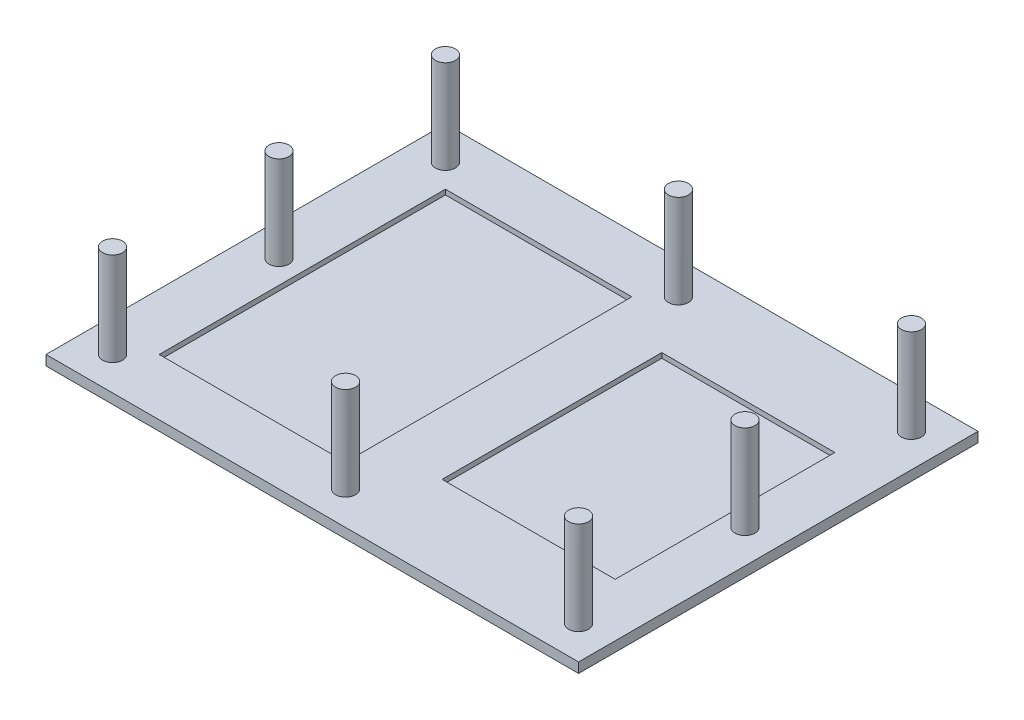
ISO-10303-21;
HEADER;
FILE_DESCRIPTION(('STEP AP214'),'2;1');
FILE_NAME('part.step','',(''),(''),'','','');
FILE_SCHEMA(('AUTOMOTIVE_DESIGN { 1 0 10303 214 1 1 1 1 }'));
ENDSEC;
DATA;
#1=APPLICATION_CONTEXT('core data for automotive mechanical design processes');
#2=APPLICATION_PROTOCOL_DEFINITION('international standard','automotive_design',2000,#1);
#3=PRODUCT_CONTEXT('',#1,'mechanical');
#4=PRODUCT('Part','Part','',(#3));
#5=PRODUCT_RELATED_PRODUCT_CATEGORY('part','',(#4));
#6=PRODUCT_DEFINITION_FORMATION('','',#4);
#7=PRODUCT_DEFINITION_CONTEXT('part definition',#1,'design');
#8=PRODUCT_DEFINITION('design','',#6,#7);
#9=PRODUCT_DEFINITION_SHAPE('','',#8);
#10=(LENGTH_UNIT() NAMED_UNIT(*) SI_UNIT(.MILLI.,.METRE.));
#11=(NAMED_UNIT(*) PLANE_ANGLE_UNIT() SI_UNIT($,.RADIAN.));
#12=(NAMED_UNIT(*) SI_UNIT($,.STERADIAN.) SOLID_ANGLE_UNIT());
#13=UNCERTAINTY_MEASURE_WITH_UNIT(LENGTH_MEASURE(1.E-05),#10,'distance_accuracy_value','');
#14=(GEOMETRIC_REPRESENTATION_CONTEXT(3) GLOBAL_UNCERTAINTY_ASSIGNED_CONTEXT((#13)) GLOBAL_UNIT_ASSIGNED_CONTEXT((#10,
#11,#12)) REPRESENTATION_CONTEXT('',''));
#15=CARTESIAN_POINT('',(0.,0.,0.));
#16=DIRECTION('',(0.,0.,1.));
#17=DIRECTION('',(1.,0.,0.));
#18=AXIS2_PLACEMENT_3D('',#15,#16,#17);
#19=CARTESIAN_POINT('',(80.,3.,60.));
#20=DIRECTION('',(-1.,0.,0.));
#21=DIRECTION('',(0.,0.,1.));
#22=AXIS2_PLACEMENT_3D('',#19,#20,#21);
#23=PLANE('',#22);
#24=DIRECTION('',(0.,0.,-1.));
#25=VECTOR('',#24,1.);
#26=CARTESIAN_POINT('',(80.,0.,60.));
#27=LINE('',#26,#25);
#28=CARTESIAN_POINT('',(80.,0.,60.));
#29=VERTEX_POINT('',#28);
#30=CARTESIAN_POINT('',(80.,0.,-60.));
#31=VERTEX_POINT('',#30);
#32=EDGE_CURVE('E250',#29,#31,#27,.T.);
#33=ORIENTED_EDGE('',*,*,#32,.T.);
#34=DIRECTION('',(0.,-1.,0.));
#35=VECTOR('',#34,1.);
#36=CARTESIAN_POINT('',(80.,3.,-60.));
#37=LINE('',#36,#35);
#38=CARTESIAN_POINT('',(80.,3.,-60.));
#39=VERTEX_POINT('',#38);
#40=EDGE_CURVE('E288',#39,#31,#37,.T.);
#41=ORIENTED_EDGE('',*,*,#40,.F.);
#42=DIRECTION('',(0.,0.,-1.));
#43=VECTOR('',#42,1.);
#44=CARTESIAN_POINT('',(80.,3.,60.));
#45=LINE('',#44,#43);
#46=CARTESIAN_POINT('',(80.,3.,60.));
#47=VERTEX_POINT('',#46);
#48=EDGE_CURVE('E251',#47,#39,#45,.T.);
#49=ORIENTED_EDGE('',*,*,#48,.F.);
#50=DIRECTION('',(0.,-1.,0.));
#51=VECTOR('',#50,1.);
#52=CARTESIAN_POINT('',(80.,3.,60.));
#53=LINE('',#52,#51);
#54=EDGE_CURVE('E265',#47,#29,#53,.T.);
#55=ORIENTED_EDGE('',*,*,#54,.T.);
#56=EDGE_LOOP('',(#33,#41,#49,#55));
#57=FACE_BOUND('',#56,.T.);
#58=ADVANCED_FACE('F39',(#57),#23,.F.);
#59=CARTESIAN_POINT('',(-80.,3.,-60.));
#60=DIRECTION('',(0.,0.,1.));
#61=DIRECTION('',(1.,0.,0.));
#62=AXIS2_PLACEMENT_3D('',#59,#60,#61);
#63=PLANE('',#62);
#64=DIRECTION('',(-1.,0.,0.));
#65=VECTOR('',#64,1.);
#66=CARTESIAN_POINT('',(-80.,0.,-60.));
#67=LINE('',#66,#65);
#68=CARTESIAN_POINT('',(-80.,0.,-60.));
#69=VERTEX_POINT('',#68);
#70=EDGE_CURVE('E269',#31,#69,#67,.T.);
#71=ORIENTED_EDGE('',*,*,#70,.T.);
#72=DIRECTION('',(0.,-1.,0.));
#73=VECTOR('',#72,1.);
#74=CARTESIAN_POINT('',(-80.,3.,-60.));
#75=LINE('',#74,#73);
#76=CARTESIAN_POINT('',(-80.,3.,-60.));
#77=VERTEX_POINT('',#76);
#78=EDGE_CURVE('E284',#77,#69,#75,.T.);
#79=ORIENTED_EDGE('',*,*,#78,.F.);
#80=DIRECTION('',(-1.,0.,0.));
#81=VECTOR('',#80,1.);
#82=CARTESIAN_POINT('',(-80.,3.,-60.));
#83=LINE('',#82,#81);
#84=EDGE_CURVE('E255',#39,#77,#83,.T.);
#85=ORIENTED_EDGE('',*,*,#84,.F.);
#86=ORIENTED_EDGE('',*,*,#40,.T.);
#87=EDGE_LOOP('',(#71,#79,#85,#86));
#88=FACE_BOUND('',#87,.T.);
#89=ADVANCED_FACE('F348',(#88),#63,.F.);
#90=CARTESIAN_POINT('',(-80.,3.,60.));
#91=DIRECTION('',(1.,0.,0.));
#92=DIRECTION('',(0.,0.,-1.));
#93=AXIS2_PLACEMENT_3D('',#90,#91,#92);
#94=PLANE('',#93);
#95=DIRECTION('',(0.,0.,1.));
#96=VECTOR('',#95,1.);
#97=CARTESIAN_POINT('',(-80.,0.,60.));
#98=LINE('',#97,#96);
#99=CARTESIAN_POINT('',(-80.,0.,60.));
#100=VERTEX_POINT('',#99);
#101=EDGE_CURVE('E272',#69,#100,#98,.T.);
#102=ORIENTED_EDGE('',*,*,#101,.T.);
#103=DIRECTION('',(0.,-1.,0.));
#104=VECTOR('',#103,1.);
#105=CARTESIAN_POINT('',(-80.,3.,60.));
#106=LINE('',#105,#104);
#107=CARTESIAN_POINT('',(-80.,3.,60.));
#108=VERTEX_POINT('',#107);
#109=EDGE_CURVE('E280',#108,#100,#106,.T.);
#110=ORIENTED_EDGE('',*,*,#109,.F.);
#111=DIRECTION('',(0.,0.,1.));
#112=VECTOR('',#111,1.);
#113=CARTESIAN_POINT('',(-80.,3.,60.));
#114=LINE('',#113,#112);
#115=EDGE_CURVE('E259',#77,#108,#114,.T.);
#116=ORIENTED_EDGE('',*,*,#115,.F.);
#117=ORIENTED_EDGE('',*,*,#78,.T.);
#118=EDGE_LOOP('',(#102,#110,#116,#117));
#119=FACE_BOUND('',#118,.T.);
#120=ADVANCED_FACE('F353',(#119),#94,.F.);
#121=CARTESIAN_POINT('',(-80.,3.,60.));
#122=DIRECTION('',(0.,0.,-1.));
#123=DIRECTION('',(-1.,0.,0.));
#124=AXIS2_PLACEMENT_3D('',#121,#122,#123);
#125=PLANE('',#124);
#126=DIRECTION('',(1.,0.,0.));
#127=VECTOR('',#126,1.);
#128=CARTESIAN_POINT('',(-80.,0.,60.));
#129=LINE('',#128,#127);
#130=EDGE_CURVE('E256',#100,#29,#129,.T.);
#131=ORIENTED_EDGE('',*,*,#130,.T.);
#132=ORIENTED_EDGE('',*,*,#54,.F.);
#133=DIRECTION('',(1.,0.,0.));
#134=VECTOR('',#133,1.);
#135=CARTESIAN_POINT('',(-80.,3.,60.));
#136=LINE('',#135,#134);
#137=EDGE_CURVE('E262',#108,#47,#136,.T.);
#138=ORIENTED_EDGE('',*,*,#137,.F.);
#139=ORIENTED_EDGE('',*,*,#109,.T.);
#140=EDGE_LOOP('',(#131,#132,#138,#139));
#141=FACE_BOUND('',#140,.T.);
#142=ADVANCED_FACE('F325',(#141),#125,.F.);
#143=CARTESIAN_POINT('',(0.,3.,0.));
#144=DIRECTION('',(0.,-1.,0.));
#145=DIRECTION('',(0.,0.,-1.));
#146=AXIS2_PLACEMENT_3D('',#143,#144,#145);
#147=PLANE('',#146);
#148=DIRECTION('',(1.,0.,0.));
#149=VECTOR('',#148,1.);
#150=CARTESIAN_POINT('',(12.,3.,33.));
#151=LINE('',#150,#149);
#152=CARTESIAN_POINT('',(12.,3.,33.));
#153=VERTEX_POINT('',#152);
#154=CARTESIAN_POINT('',(64.,3.,33.));
#155=VERTEX_POINT('',#154);
#156=EDGE_CURVE('E164',#153,#155,#151,.T.);
#157=ORIENTED_EDGE('',*,*,#156,.F.);
#158=DIRECTION('',(0.,0.,1.));
#159=VECTOR('',#158,1.);
#160=CARTESIAN_POINT('',(12.,3.,-33.));
#161=LINE('',#160,#159);
#162=CARTESIAN_POINT('',(12.,3.,-33.));
#163=VERTEX_POINT('',#162);
#164=EDGE_CURVE('E54',#163,#153,#161,.T.);
#165=ORIENTED_EDGE('',*,*,#164,.F.);
#166=DIRECTION('',(-1.,0.,0.));
#167=VECTOR('',#166,1.);
#168=CARTESIAN_POINT('',(12.,3.,-33.));
#169=LINE('',#168,#167);
#170=CARTESIAN_POINT('',(64.,3.,-33.));
#171=VERTEX_POINT('',#170);
#172=EDGE_CURVE('E151',#171,#163,#169,.T.);
#173=ORIENTED_EDGE('',*,*,#172,.F.);
#174=DIRECTION('',(0.,0.,-1.));
#175=VECTOR('',#174,1.);
#176=CARTESIAN_POINT('',(64.,3.,-33.));
#177=LINE('',#176,#175);
#178=EDGE_CURVE('E155',#155,#171,#177,.T.);
#179=ORIENTED_EDGE('',*,*,#178,.F.);
#180=EDGE_LOOP('',(#157,#165,#173,#179));
#181=FACE_BOUND('',#180,.T.);
#182=DIRECTION('',(0.,0.,-1.));
#183=VECTOR('',#182,1.);
#184=CARTESIAN_POINT('',(-6.99999999999999,3.,43.));
#185=LINE('',#184,#183);
#186=CARTESIAN_POINT('',(-6.99999999999999,3.,43.));
#187=VERTEX_POINT('',#186);
#188=CARTESIAN_POINT('',(-6.99999999999999,3.,-43.));
#189=VERTEX_POINT('',#188);
#190=EDGE_CURVE('E196',#187,#189,#185,.T.);
#191=ORIENTED_EDGE('',*,*,#190,.F.);
#192=DIRECTION('',(1.,0.,0.));
#193=VECTOR('',#192,1.);
#194=CARTESIAN_POINT('',(-63.,3.,43.));
#195=LINE('',#194,#193);
#196=CARTESIAN_POINT('',(-63.,3.,43.));
#197=VERTEX_POINT('',#196);
#198=EDGE_CURVE('E62',#197,#187,#195,.T.);
#199=ORIENTED_EDGE('',*,*,#198,.F.);
#200=DIRECTION('',(0.,0.,-1.));
#201=VECTOR('',#200,1.);
#202=CARTESIAN_POINT('',(-63.,3.,43.));
#203=LINE('',#202,#201);
#204=CARTESIAN_POINT('',(-63.,3.,-43.));
#205=VERTEX_POINT('',#204);
#206=EDGE_CURVE('E183',#197,#205,#203,.T.);
#207=ORIENTED_EDGE('',*,*,#206,.T.);
#208=DIRECTION('',(1.,0.,0.));
#209=VECTOR('',#208,1.);
#210=CARTESIAN_POINT('',(-63.,3.,-43.));
#211=LINE('',#210,#209);
#212=EDGE_CURVE('E200',#205,#189,#211,.T.);
#213=ORIENTED_EDGE('',*,*,#212,.T.);
#214=EDGE_LOOP('',(#191,#199,#207,#213));
#215=FACE_BOUND('',#214,.T.);
#216=CARTESIAN_POINT('',(70.,3.,50.));
#217=DIRECTION('',(0.,-1.,0.));
#218=DIRECTION('',(0.,0.,-1.));
#219=AXIS2_PLACEMENT_3D('',#216,#217,#218);
#220=CIRCLE('',#219,3.00000000000001);
#221=CARTESIAN_POINT('',(70.,3.,47.));
#222=VERTEX_POINT('',#221);
#223=EDGE_CURVE('E11',#222,#222,#220,.F.);
#224=ORIENTED_EDGE('',*,*,#223,.F.);
#225=EDGE_LOOP('',(#224));
#226=FACE_BOUND('',#225,.T.);
#227=CARTESIAN_POINT('',(0.,3.,50.));
#228=DIRECTION('',(0.,-1.,0.));
#229=DIRECTION('',(0.,0.,-1.));
#230=AXIS2_PLACEMENT_3D('',#227,#228,#229);
#231=CIRCLE('',#230,3.);
#232=CARTESIAN_POINT('',(0.,3.,47.));
#233=VERTEX_POINT('',#232);
#234=EDGE_CURVE('E47',#233,#233,#231,.F.);
#235=ORIENTED_EDGE('',*,*,#234,.F.);
#236=EDGE_LOOP('',(#235));
#237=FACE_BOUND('',#236,.T.);
#238=CARTESIAN_POINT('',(-70.,3.,50.));
#239=DIRECTION('',(0.,-1.,0.));
#240=DIRECTION('',(0.,0.,-1.));
#241=AXIS2_PLACEMENT_3D('',#238,#239,#240);
#242=CIRCLE('',#241,3.00000000000001);
#243=CARTESIAN_POINT('',(-70.,3.,47.));
#244=VERTEX_POINT('',#243);
#245=EDGE_CURVE('E312',#244,#244,#242,.F.);
#246=ORIENTED_EDGE('',*,*,#245,.F.);
#247=EDGE_LOOP('',(#246));
#248=FACE_BOUND('',#247,.T.);
#249=CARTESIAN_POINT('',(70.,3.,0.));
#250=DIRECTION('',(0.,-1.,0.));
#251=DIRECTION('',(0.,0.,-1.));
#252=AXIS2_PLACEMENT_3D('',#249,#250,#251);
#253=CIRCLE('',#252,3.00000000000001);
#254=CARTESIAN_POINT('',(70.,3.,-3.00000000000001));
#255=VERTEX_POINT('',#254);
#256=EDGE_CURVE('E308',#255,#255,#253,.F.);
#257=ORIENTED_EDGE('',*,*,#256,.F.);
#258=EDGE_LOOP('',(#257));
#259=FACE_BOUND('',#258,.T.);
#260=CARTESIAN_POINT('',(-70.,3.,0.));
#261=DIRECTION('',(0.,-1.,0.));
#262=DIRECTION('',(0.,0.,-1.));
#263=AXIS2_PLACEMENT_3D('',#260,#261,#262);
#264=CIRCLE('',#263,3.00000000000001);
#265=CARTESIAN_POINT('',(-70.,3.,-3.00000000000001));
#266=VERTEX_POINT('',#265);
#267=EDGE_CURVE('E304',#266,#266,#264,.F.);
#268=ORIENTED_EDGE('',*,*,#267,.F.);
#269=EDGE_LOOP('',(#268));
#270=FACE_BOUND('',#269,.T.);
#271=CARTESIAN_POINT('',(70.,3.,-50.));
#272=DIRECTION('',(0.,-1.,0.));
#273=DIRECTION('',(0.,0.,-1.));
#274=AXIS2_PLACEMENT_3D('',#271,#272,#273);
#275=CIRCLE('',#274,3.00000000000001);
#276=CARTESIAN_POINT('',(70.,3.,-53.));
#277=VERTEX_POINT('',#276);
#278=EDGE_CURVE('E300',#277,#277,#275,.F.);
#279=ORIENTED_EDGE('',*,*,#278,.F.);
#280=EDGE_LOOP('',(#279));
#281=FACE_BOUND('',#280,.T.);
#282=CARTESIAN_POINT('',(0.,3.,-50.));
#283=DIRECTION('',(0.,-1.,0.));
#284=DIRECTION('',(0.,0.,-1.));
#285=AXIS2_PLACEMENT_3D('',#282,#283,#284);
#286=CIRCLE('',#285,3.);
#287=CARTESIAN_POINT('',(0.,3.,-53.));
#288=VERTEX_POINT('',#287);
#289=EDGE_CURVE('E296',#288,#288,#286,.F.);
#290=ORIENTED_EDGE('',*,*,#289,.F.);
#291=EDGE_LOOP('',(#290));
#292=FACE_BOUND('',#291,.T.);
#293=CARTESIAN_POINT('',(-70.,3.,-50.));
#294=DIRECTION('',(0.,-1.,0.));
#295=DIRECTION('',(0.,0.,-1.));
#296=AXIS2_PLACEMENT_3D('',#293,#294,#295);
#297=CIRCLE('',#296,3.00000000000001);
#298=CARTESIAN_POINT('',(-70.,3.,-53.));
#299=VERTEX_POINT('',#298);
#300=EDGE_CURVE('E292',#299,#299,#297,.F.);
#301=ORIENTED_EDGE('',*,*,#300,.F.);
#302=EDGE_LOOP('',(#301));
#303=FACE_BOUND('',#302,.T.);
#304=ORIENTED_EDGE('',*,*,#48,.T.);
#305=ORIENTED_EDGE('',*,*,#84,.T.);
#306=ORIENTED_EDGE('',*,*,#115,.T.);
#307=ORIENTED_EDGE('',*,*,#137,.T.);
#308=EDGE_LOOP('',(#304,#305,#306,#307));
#309=FACE_BOUND('',#308,.T.);
#310=ADVANCED_FACE('F321',(#181,#215,#226,#237,#248,#259,#270,#281,#292,#303,#309),#147,.F.);
#311=CARTESIAN_POINT('',(0.,0.,0.));
#312=DIRECTION('',(0.,-1.,0.));
#313=DIRECTION('',(0.,0.,-1.));
#314=AXIS2_PLACEMENT_3D('',#311,#312,#313);
#315=PLANE('',#314);
#316=ORIENTED_EDGE('',*,*,#32,.F.);
#317=ORIENTED_EDGE('',*,*,#130,.F.);
#318=ORIENTED_EDGE('',*,*,#101,.F.);
#319=ORIENTED_EDGE('',*,*,#70,.F.);
#320=EDGE_LOOP('',(#316,#317,#318,#319));
#321=FACE_BOUND('',#320,.T.);
#322=ADVANCED_FACE('F324',(#321),#315,.T.);
#323=CARTESIAN_POINT('',(-70.,31.,-50.));
#324=DIRECTION('',(0.,-1.,0.));
#325=DIRECTION('',(0.,0.,-1.));
#326=AXIS2_PLACEMENT_3D('',#323,#324,#325);
#327=CYLINDRICAL_SURFACE('',#326,3.00000000000001);
#328=CARTESIAN_POINT('',(-70.,31.,-50.));
#329=DIRECTION('',(0.,1.,0.));
#330=DIRECTION('',(0.,0.,1.));
#331=AXIS2_PLACEMENT_3D('',#328,#329,#330);
#332=CIRCLE('',#331,3.00000000000001);
#333=CARTESIAN_POINT('',(-70.,31.,-46.9999999999999));
#334=VERTEX_POINT('',#333);
#335=EDGE_CURVE('E246',#334,#334,#332,.T.);
#336=ORIENTED_EDGE('',*,*,#335,.F.);
#337=EDGE_LOOP('',(#336));
#338=FACE_BOUND('',#337,.T.);
#339=ORIENTED_EDGE('',*,*,#300,.T.);
#340=EDGE_LOOP('',(#339));
#341=FACE_BOUND('',#340,.T.);
#342=ADVANCED_FACE('F358',(#338,#341),#327,.T.);
#343=CARTESIAN_POINT('',(-70.,31.,-50.));
#344=DIRECTION('',(0.,1.,0.));
#345=DIRECTION('',(0.,0.,1.));
#346=AXIS2_PLACEMENT_3D('',#343,#344,#345);
#347=PLANE('',#346);
#348=ORIENTED_EDGE('',*,*,#335,.T.);
#349=EDGE_LOOP('',(#348));
#350=FACE_BOUND('',#349,.T.);
#351=ADVANCED_FACE('F363',(#350),#347,.T.);
#352=CARTESIAN_POINT('',(0.,31.,-50.));
#353=DIRECTION('',(0.,-1.,0.));
#354=DIRECTION('',(0.,0.,-1.));
#355=AXIS2_PLACEMENT_3D('',#352,#353,#354);
#356=CYLINDRICAL_SURFACE('',#355,3.);
#357=CARTESIAN_POINT('',(0.,31.,-50.));
#358=DIRECTION('',(0.,1.,0.));
#359=DIRECTION('',(0.,0.,1.));
#360=AXIS2_PLACEMENT_3D('',#357,#358,#359);
#361=CIRCLE('',#360,3.);
#362=CARTESIAN_POINT('',(0.,31.,-47.));
#363=VERTEX_POINT('',#362);
#364=EDGE_CURVE('E242',#363,#363,#361,.T.);
#365=ORIENTED_EDGE('',*,*,#364,.F.);
#366=EDGE_LOOP('',(#365));
#367=FACE_BOUND('',#366,.T.);
#368=ORIENTED_EDGE('',*,*,#289,.T.);
#369=EDGE_LOOP('',(#368));
#370=FACE_BOUND('',#369,.T.);
#371=ADVANCED_FACE('F507',(#367,#370),#356,.T.);
#372=CARTESIAN_POINT('',(0.,31.,-50.));
#373=DIRECTION('',(0.,1.,0.));
#374=DIRECTION('',(0.,0.,1.));
#375=AXIS2_PLACEMENT_3D('',#372,#373,#374);
#376=PLANE('',#375);
#377=ORIENTED_EDGE('',*,*,#364,.T.);
#378=EDGE_LOOP('',(#377));
#379=FACE_BOUND('',#378,.T.);
#380=ADVANCED_FACE('F503',(#379),#376,.T.);
#381=CARTESIAN_POINT('',(70.,31.,-50.));
#382=DIRECTION('',(0.,-1.,0.));
#383=DIRECTION('',(0.,0.,-1.));
#384=AXIS2_PLACEMENT_3D('',#381,#382,#383);
#385=CYLINDRICAL_SURFACE('',#384,3.00000000000001);
#386=CARTESIAN_POINT('',(70.,31.,-50.));
#387=DIRECTION('',(0.,1.,0.));
#388=DIRECTION('',(0.,0.,1.));
#389=AXIS2_PLACEMENT_3D('',#386,#387,#388);
#390=CIRCLE('',#389,3.00000000000001);
#391=CARTESIAN_POINT('',(70.,31.,-47.));
#392=VERTEX_POINT('',#391);
#393=EDGE_CURVE('E238',#392,#392,#390,.T.);
#394=ORIENTED_EDGE('',*,*,#393,.F.);
#395=EDGE_LOOP('',(#394));
#396=FACE_BOUND('',#395,.T.);
#397=ORIENTED_EDGE('',*,*,#278,.T.);
#398=EDGE_LOOP('',(#397));
#399=FACE_BOUND('',#398,.T.);
#400=ADVANCED_FACE('F499',(#396,#399),#385,.T.);
#401=CARTESIAN_POINT('',(70.,31.,-50.));
#402=DIRECTION('',(0.,1.,0.));
#403=DIRECTION('',(0.,0.,1.));
#404=AXIS2_PLACEMENT_3D('',#401,#402,#403);
#405=PLANE('',#404);
#406=ORIENTED_EDGE('',*,*,#393,.T.);
#407=EDGE_LOOP('',(#406));
#408=FACE_BOUND('',#407,.T.);
#409=ADVANCED_FACE('F495',(#408),#405,.T.);
#410=CARTESIAN_POINT('',(-70.,31.,0.));
#411=DIRECTION('',(0.,-1.,0.));
#412=DIRECTION('',(0.,0.,-1.));
#413=AXIS2_PLACEMENT_3D('',#410,#411,#412);
#414=CYLINDRICAL_SURFACE('',#413,3.00000000000001);
#415=CARTESIAN_POINT('',(-70.,31.,0.));
#416=DIRECTION('',(0.,1.,0.));
#417=DIRECTION('',(0.,0.,1.));
#418=AXIS2_PLACEMENT_3D('',#415,#416,#417);
#419=CIRCLE('',#418,3.00000000000001);
#420=CARTESIAN_POINT('',(-70.,31.,3.00000000000001));
#421=VERTEX_POINT('',#420);
#422=EDGE_CURVE('E234',#421,#421,#419,.T.);
#423=ORIENTED_EDGE('',*,*,#422,.F.);
#424=EDGE_LOOP('',(#423));
#425=FACE_BOUND('',#424,.T.);
#426=ORIENTED_EDGE('',*,*,#267,.T.);
#427=EDGE_LOOP('',(#426));
#428=FACE_BOUND('',#427,.T.);
#429=ADVANCED_FACE('F491',(#425,#428),#414,.T.);
#430=CARTESIAN_POINT('',(-70.,31.,0.));
#431=DIRECTION('',(0.,1.,0.));
#432=DIRECTION('',(0.,0.,1.));
#433=AXIS2_PLACEMENT_3D('',#430,#431,#432);
#434=PLANE('',#433);
#435=ORIENTED_EDGE('',*,*,#422,.T.);
#436=EDGE_LOOP('',(#435));
#437=FACE_BOUND('',#436,.T.);
#438=ADVANCED_FACE('F487',(#437),#434,.T.);
#439=CARTESIAN_POINT('',(70.,31.,0.));
#440=DIRECTION('',(0.,-1.,0.));
#441=DIRECTION('',(0.,0.,-1.));
#442=AXIS2_PLACEMENT_3D('',#439,#440,#441);
#443=CYLINDRICAL_SURFACE('',#442,3.00000000000001);
#444=CARTESIAN_POINT('',(70.,31.,0.));
#445=DIRECTION('',(0.,1.,0.));
#446=DIRECTION('',(0.,0.,1.));
#447=AXIS2_PLACEMENT_3D('',#444,#445,#446);
#448=CIRCLE('',#447,3.00000000000001);
#449=CARTESIAN_POINT('',(70.,31.,3.00000000000001));
#450=VERTEX_POINT('',#449);
#451=EDGE_CURVE('E230',#450,#450,#448,.T.);
#452=ORIENTED_EDGE('',*,*,#451,.F.);
#453=EDGE_LOOP('',(#452));
#454=FACE_BOUND('',#453,.T.);
#455=ORIENTED_EDGE('',*,*,#256,.T.);
#456=EDGE_LOOP('',(#455));
#457=FACE_BOUND('',#456,.T.);
#458=ADVANCED_FACE('F483',(#454,#457),#443,.T.);
#459=CARTESIAN_POINT('',(70.,31.,0.));
#460=DIRECTION('',(0.,1.,0.));
#461=DIRECTION('',(0.,0.,1.));
#462=AXIS2_PLACEMENT_3D('',#459,#460,#461);
#463=PLANE('',#462);
#464=ORIENTED_EDGE('',*,*,#451,.T.);
#465=EDGE_LOOP('',(#464));
#466=FACE_BOUND('',#465,.T.);
#467=ADVANCED_FACE('F479',(#466),#463,.T.);
#468=CARTESIAN_POINT('',(-70.,31.,50.));
#469=DIRECTION('',(0.,-1.,0.));
#470=DIRECTION('',(0.,0.,-1.));
#471=AXIS2_PLACEMENT_3D('',#468,#469,#470);
#472=CYLINDRICAL_SURFACE('',#471,3.00000000000001);
#473=CARTESIAN_POINT('',(-70.,31.,50.));
#474=DIRECTION('',(0.,1.,0.));
#475=DIRECTION('',(0.,0.,1.));
#476=AXIS2_PLACEMENT_3D('',#473,#474,#475);
#477=CIRCLE('',#476,3.00000000000001);
#478=CARTESIAN_POINT('',(-70.,31.,53.));
#479=VERTEX_POINT('',#478);
#480=EDGE_CURVE('E226',#479,#479,#477,.T.);
#481=ORIENTED_EDGE('',*,*,#480,.F.);
#482=EDGE_LOOP('',(#481));
#483=FACE_BOUND('',#482,.T.);
#484=ORIENTED_EDGE('',*,*,#245,.T.);
#485=EDGE_LOOP('',(#484));
#486=FACE_BOUND('',#485,.T.);
#487=ADVANCED_FACE('F475',(#483,#486),#472,.T.);
#488=CARTESIAN_POINT('',(-70.,31.,50.));
#489=DIRECTION('',(0.,1.,0.));
#490=DIRECTION('',(0.,0.,1.));
#491=AXIS2_PLACEMENT_3D('',#488,#489,#490);
#492=PLANE('',#491);
#493=ORIENTED_EDGE('',*,*,#480,.T.);
#494=EDGE_LOOP('',(#493));
#495=FACE_BOUND('',#494,.T.);
#496=ADVANCED_FACE('F471',(#495),#492,.T.);
#497=CARTESIAN_POINT('',(0.,31.,50.));
#498=DIRECTION('',(0.,-1.,0.));
#499=DIRECTION('',(0.,0.,-1.));
#500=AXIS2_PLACEMENT_3D('',#497,#498,#499);
#501=CYLINDRICAL_SURFACE('',#500,3.);
#502=CARTESIAN_POINT('',(0.,31.,50.));
#503=DIRECTION('',(0.,1.,0.));
#504=DIRECTION('',(0.,0.,1.));
#505=AXIS2_PLACEMENT_3D('',#502,#503,#504);
#506=CIRCLE('',#505,3.);
#507=CARTESIAN_POINT('',(0.,31.,53.));
#508=VERTEX_POINT('',#507);
#509=EDGE_CURVE('E222',#508,#508,#506,.T.);
#510=ORIENTED_EDGE('',*,*,#509,.F.);
#511=EDGE_LOOP('',(#510));
#512=FACE_BOUND('',#511,.T.);
#513=ORIENTED_EDGE('',*,*,#234,.T.);
#514=EDGE_LOOP('',(#513));
#515=FACE_BOUND('',#514,.T.);
#516=ADVANCED_FACE('F319',(#512,#515),#501,.T.);
#517=CARTESIAN_POINT('',(0.,31.,50.));
#518=DIRECTION('',(0.,1.,0.));
#519=DIRECTION('',(0.,0.,1.));
#520=AXIS2_PLACEMENT_3D('',#517,#518,#519);
#521=PLANE('',#520);
#522=ORIENTED_EDGE('',*,*,#509,.T.);
#523=EDGE_LOOP('',(#522));
#524=FACE_BOUND('',#523,.T.);
#525=ADVANCED_FACE('F464',(#524),#521,.T.);
#526=CARTESIAN_POINT('',(70.,31.,50.));
#527=DIRECTION('',(0.,-1.,0.));
#528=DIRECTION('',(0.,0.,-1.));
#529=AXIS2_PLACEMENT_3D('',#526,#527,#528);
#530=CYLINDRICAL_SURFACE('',#529,3.00000000000001);
#531=CARTESIAN_POINT('',(70.,31.,50.));
#532=DIRECTION('',(0.,1.,0.));
#533=DIRECTION('',(0.,0.,1.));
#534=AXIS2_PLACEMENT_3D('',#531,#532,#533);
#535=CIRCLE('',#534,3.00000000000001);
#536=CARTESIAN_POINT('',(70.,31.,53.));
#537=VERTEX_POINT('',#536);
#538=EDGE_CURVE('E210',#537,#537,#535,.T.);
#539=ORIENTED_EDGE('',*,*,#538,.F.);
#540=EDGE_LOOP('',(#539));
#541=FACE_BOUND('',#540,.T.);
#542=ORIENTED_EDGE('',*,*,#223,.T.);
#543=EDGE_LOOP('',(#542));
#544=FACE_BOUND('',#543,.T.);
#545=ADVANCED_FACE('F460',(#541,#544),#530,.T.);
#546=CARTESIAN_POINT('',(70.,31.,50.));
#547=DIRECTION('',(0.,1.,0.));
#548=DIRECTION('',(0.,0.,1.));
#549=AXIS2_PLACEMENT_3D('',#546,#547,#548);
#550=PLANE('',#549);
#551=ORIENTED_EDGE('',*,*,#538,.T.);
#552=EDGE_LOOP('',(#551));
#553=FACE_BOUND('',#552,.T.);
#554=ADVANCED_FACE('F457',(#553),#550,.T.);
#555=CARTESIAN_POINT('',(-63.,1.5,43.));
#556=DIRECTION('',(0.,0.,1.));
#557=DIRECTION('',(1.,0.,0.));
#558=AXIS2_PLACEMENT_3D('',#555,#556,#557);
#559=PLANE('',#558);
#560=ORIENTED_EDGE('',*,*,#198,.T.);
#561=DIRECTION('',(0.,1.,0.));
#562=VECTOR('',#561,1.);
#563=CARTESIAN_POINT('',(-6.99999999999999,1.5,43.));
#564=LINE('',#563,#562);
#565=CARTESIAN_POINT('',(-6.99999999999999,1.5,43.));
#566=VERTEX_POINT('',#565);
#567=EDGE_CURVE('E193',#566,#187,#564,.T.);
#568=ORIENTED_EDGE('',*,*,#567,.F.);
#569=DIRECTION('',(1.,0.,0.));
#570=VECTOR('',#569,1.);
#571=CARTESIAN_POINT('',(-63.,1.5,43.));
#572=LINE('',#571,#570);
#573=CARTESIAN_POINT('',(-63.,1.5,43.));
#574=VERTEX_POINT('',#573);
#575=EDGE_CURVE('E178',#574,#566,#572,.T.);
#576=ORIENTED_EDGE('',*,*,#575,.F.);
#577=DIRECTION('',(0.,1.,0.));
#578=VECTOR('',#577,1.);
#579=CARTESIAN_POINT('',(-63.,1.5,43.));
#580=LINE('',#579,#578);
#581=EDGE_CURVE('E207',#574,#197,#580,.T.);
#582=ORIENTED_EDGE('',*,*,#581,.T.);
#583=EDGE_LOOP('',(#560,#568,#576,#582));
#584=FACE_BOUND('',#583,.T.);
#585=ADVANCED_FACE('F447',(#584),#559,.F.);
#586=CARTESIAN_POINT('',(-63.,1.5,43.));
#587=DIRECTION('',(1.,0.,0.));
#588=DIRECTION('',(0.,0.,-1.));
#589=AXIS2_PLACEMENT_3D('',#586,#587,#588);
#590=PLANE('',#589);
#591=ORIENTED_EDGE('',*,*,#206,.F.);
#592=ORIENTED_EDGE('',*,*,#581,.F.);
#593=DIRECTION('',(0.,0.,-1.));
#594=VECTOR('',#593,1.);
#595=CARTESIAN_POINT('',(-63.,1.5,43.));
#596=LINE('',#595,#594);
#597=CARTESIAN_POINT('',(-63.,1.5,-43.));
#598=VERTEX_POINT('',#597);
#599=EDGE_CURVE('E190',#574,#598,#596,.T.);
#600=ORIENTED_EDGE('',*,*,#599,.T.);
#601=DIRECTION('',(0.,1.,0.));
#602=VECTOR('',#601,1.);
#603=CARTESIAN_POINT('',(-63.,1.5,-43.));
#604=LINE('',#603,#602);
#605=EDGE_CURVE('E211',#598,#205,#604,.T.);
#606=ORIENTED_EDGE('',*,*,#605,.T.);
#607=EDGE_LOOP('',(#591,#592,#600,#606));
#608=FACE_BOUND('',#607,.T.);
#609=ADVANCED_FACE('F443',(#608),#590,.T.);
#610=CARTESIAN_POINT('',(-63.,1.5,-43.));
#611=DIRECTION('',(0.,0.,1.));
#612=DIRECTION('',(1.,0.,0.));
#613=AXIS2_PLACEMENT_3D('',#610,#611,#612);
#614=PLANE('',#613);
#615=ORIENTED_EDGE('',*,*,#212,.F.);
#616=ORIENTED_EDGE('',*,*,#605,.F.);
#617=DIRECTION('',(1.,0.,0.));
#618=VECTOR('',#617,1.);
#619=CARTESIAN_POINT('',(-63.,1.5,-43.));
#620=LINE('',#619,#618);
#621=CARTESIAN_POINT('',(-6.99999999999999,1.5,-43.));
#622=VERTEX_POINT('',#621);
#623=EDGE_CURVE('E187',#598,#622,#620,.T.);
#624=ORIENTED_EDGE('',*,*,#623,.T.);
#625=DIRECTION('',(0.,1.,0.));
#626=VECTOR('',#625,1.);
#627=CARTESIAN_POINT('',(-6.99999999999999,1.5,-43.));
#628=LINE('',#627,#626);
#629=EDGE_CURVE('E214',#622,#189,#628,.T.);
#630=ORIENTED_EDGE('',*,*,#629,.T.);
#631=EDGE_LOOP('',(#615,#616,#624,#630));
#632=FACE_BOUND('',#631,.T.);
#633=ADVANCED_FACE('F446',(#632),#614,.T.);
#634=CARTESIAN_POINT('',(-6.99999999999999,1.5,43.));
#635=DIRECTION('',(1.,0.,0.));
#636=DIRECTION('',(0.,0.,-1.));
#637=AXIS2_PLACEMENT_3D('',#634,#635,#636);
#638=PLANE('',#637);
#639=ORIENTED_EDGE('',*,*,#190,.T.);
#640=ORIENTED_EDGE('',*,*,#629,.F.);
#641=DIRECTION('',(0.,0.,-1.));
#642=VECTOR('',#641,1.);
#643=CARTESIAN_POINT('',(-6.99999999999999,1.5,43.));
#644=LINE('',#643,#642);
#645=EDGE_CURVE('E182',#566,#622,#644,.T.);
#646=ORIENTED_EDGE('',*,*,#645,.F.);
#647=ORIENTED_EDGE('',*,*,#567,.T.);
#648=EDGE_LOOP('',(#639,#640,#646,#647));
#649=FACE_BOUND('',#648,.T.);
#650=ADVANCED_FACE('F441',(#649),#638,.F.);
#651=CARTESIAN_POINT('',(0.,1.5,0.));
#652=DIRECTION('',(0.,1.,0.));
#653=DIRECTION('',(0.,0.,1.));
#654=AXIS2_PLACEMENT_3D('',#651,#652,#653);
#655=PLANE('',#654);
#656=ORIENTED_EDGE('',*,*,#575,.T.);
#657=ORIENTED_EDGE('',*,*,#645,.T.);
#658=ORIENTED_EDGE('',*,*,#623,.F.);
#659=ORIENTED_EDGE('',*,*,#599,.F.);
#660=EDGE_LOOP('',(#656,#657,#658,#659));
#661=FACE_BOUND('',#660,.T.);
#662=ADVANCED_FACE('F391',(#661),#655,.T.);
#663=CARTESIAN_POINT('',(12.,1.5,-33.));
#664=DIRECTION('',(-1.,0.,0.));
#665=DIRECTION('',(0.,0.,1.));
#666=AXIS2_PLACEMENT_3D('',#663,#664,#665);
#667=PLANE('',#666);
#668=ORIENTED_EDGE('',*,*,#164,.T.);
#669=DIRECTION('',(0.,1.,0.));
#670=VECTOR('',#669,1.);
#671=CARTESIAN_POINT('',(12.,1.5,33.));
#672=LINE('',#671,#670);
#673=CARTESIAN_POINT('',(12.,1.5,33.));
#674=VERTEX_POINT('',#673);
#675=EDGE_CURVE('E126',#674,#153,#672,.T.);
#676=ORIENTED_EDGE('',*,*,#675,.F.);
#677=DIRECTION('',(0.,0.,1.));
#678=VECTOR('',#677,1.);
#679=CARTESIAN_POINT('',(12.,1.5,-33.));
#680=LINE('',#679,#678);
#681=CARTESIAN_POINT('',(12.,1.5,-33.));
#682=VERTEX_POINT('',#681);
#683=EDGE_CURVE('E130',#682,#674,#680,.T.);
#684=ORIENTED_EDGE('',*,*,#683,.F.);
#685=DIRECTION('',(0.,1.,0.));
#686=VECTOR('',#685,1.);
#687=CARTESIAN_POINT('',(12.,1.5,-33.));
#688=LINE('',#687,#686);
#689=EDGE_CURVE('E170',#682,#163,#688,.T.);
#690=ORIENTED_EDGE('',*,*,#689,.T.);
#691=EDGE_LOOP('',(#668,#676,#684,#690));
#692=FACE_BOUND('',#691,.T.);
#693=ADVANCED_FACE('F128',(#692),#667,.F.);
#694=CARTESIAN_POINT('',(12.,1.5,-33.));
#695=DIRECTION('',(0.,0.,-1.));
#696=DIRECTION('',(-1.,0.,0.));
#697=AXIS2_PLACEMENT_3D('',#694,#695,#696);
#698=PLANE('',#697);
#699=ORIENTED_EDGE('',*,*,#172,.T.);
#700=ORIENTED_EDGE('',*,*,#689,.F.);
#701=DIRECTION('',(-1.,0.,0.));
#702=VECTOR('',#701,1.);
#703=CARTESIAN_POINT('',(12.,1.5,-33.));
#704=LINE('',#703,#702);
#705=CARTESIAN_POINT('',(64.,1.5,-33.));
#706=VERTEX_POINT('',#705);
#707=EDGE_CURVE('E137',#706,#682,#704,.T.);
#708=ORIENTED_EDGE('',*,*,#707,.F.);
#709=DIRECTION('',(0.,1.,0.));
#710=VECTOR('',#709,1.);
#711=CARTESIAN_POINT('',(64.,1.5,-33.));
#712=LINE('',#711,#710);
#713=EDGE_CURVE('E173',#706,#171,#712,.T.);
#714=ORIENTED_EDGE('',*,*,#713,.T.);
#715=EDGE_LOOP('',(#699,#700,#708,#714));
#716=FACE_BOUND('',#715,.T.);
#717=ADVANCED_FACE('F400',(#716),#698,.F.);
#718=CARTESIAN_POINT('',(64.,1.5,-33.));
#719=DIRECTION('',(1.,0.,0.));
#720=DIRECTION('',(0.,0.,-1.));
#721=AXIS2_PLACEMENT_3D('',#718,#719,#720);
#722=PLANE('',#721);
#723=ORIENTED_EDGE('',*,*,#178,.T.);
#724=ORIENTED_EDGE('',*,*,#713,.F.);
#725=DIRECTION('',(0.,0.,-1.));
#726=VECTOR('',#725,1.);
#727=CARTESIAN_POINT('',(64.,1.5,-33.));
#728=LINE('',#727,#726);
#729=CARTESIAN_POINT('',(64.,1.5,33.));
#730=VERTEX_POINT('',#729);
#731=EDGE_CURVE('E146',#730,#706,#728,.T.);
#732=ORIENTED_EDGE('',*,*,#731,.F.);
#733=DIRECTION('',(0.,1.,0.));
#734=VECTOR('',#733,1.);
#735=CARTESIAN_POINT('',(64.,1.5,33.));
#736=LINE('',#735,#734);
#737=EDGE_CURVE('E136',#730,#155,#736,.T.);
#738=ORIENTED_EDGE('',*,*,#737,.T.);
#739=EDGE_LOOP('',(#723,#724,#732,#738));
#740=FACE_BOUND('',#739,.T.);
#741=ADVANCED_FACE('F409',(#740),#722,.F.);
#742=CARTESIAN_POINT('',(12.,1.5,33.));
#743=DIRECTION('',(0.,0.,1.));
#744=DIRECTION('',(1.,0.,0.));
#745=AXIS2_PLACEMENT_3D('',#742,#743,#744);
#746=PLANE('',#745);
#747=ORIENTED_EDGE('',*,*,#156,.T.);
#748=ORIENTED_EDGE('',*,*,#737,.F.);
#749=DIRECTION('',(1.,0.,0.));
#750=VECTOR('',#749,1.);
#751=CARTESIAN_POINT('',(12.,1.5,33.));
#752=LINE('',#751,#750);
#753=EDGE_CURVE('E140',#674,#730,#752,.T.);
#754=ORIENTED_EDGE('',*,*,#753,.F.);
#755=ORIENTED_EDGE('',*,*,#675,.T.);
#756=EDGE_LOOP('',(#747,#748,#754,#755));
#757=FACE_BOUND('',#756,.T.);
#758=ADVANCED_FACE('F141',(#757),#746,.F.);
#759=CARTESIAN_POINT('',(0.,1.5,0.));
#760=DIRECTION('',(0.,1.,0.));
#761=DIRECTION('',(0.,0.,1.));
#762=AXIS2_PLACEMENT_3D('',#759,#760,#761);
#763=PLANE('',#762);
#764=ORIENTED_EDGE('',*,*,#683,.T.);
#765=ORIENTED_EDGE('',*,*,#753,.T.);
#766=ORIENTED_EDGE('',*,*,#731,.T.);
#767=ORIENTED_EDGE('',*,*,#707,.T.);
#768=EDGE_LOOP('',(#764,#765,#766,#767));
#769=FACE_BOUND('',#768,.T.);
#770=ADVANCED_FACE('F148',(#769),#763,.T.);
#771=CLOSED_SHELL('',(#58,#89,#120,#142,#310,#322,#342,#351,#371,#380,#400,#409,#429,#438,#458,
#467,#487,#496,#516,#525,#545,#554,#585,#609,#633,#650,#662,#693,#717,#741,#758,#770));
#772=MANIFOLD_SOLID_BREP('B2',#771);
#773=ADVANCED_BREP_SHAPE_REPRESENTATION('',(#18,#772),#14);
#774=SHAPE_DEFINITION_REPRESENTATION(#9,#773);
ENDSEC;
END-ISO-10303-21;
